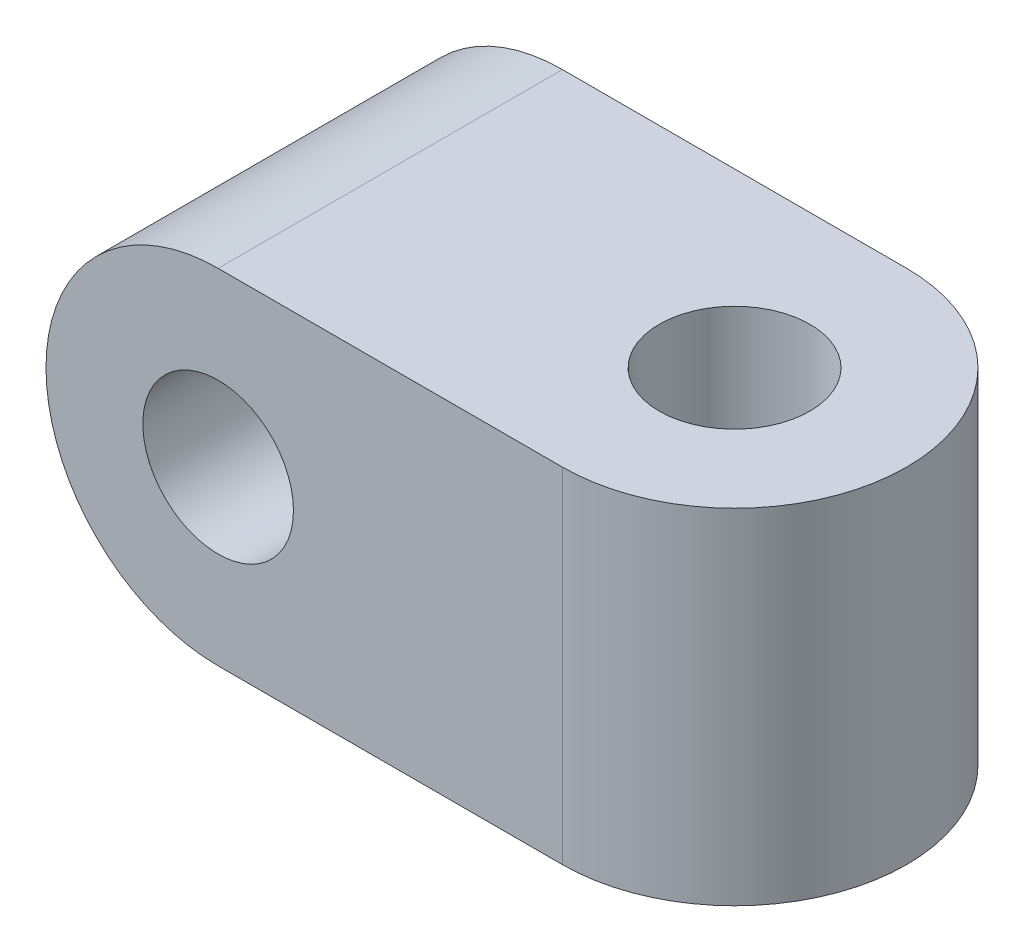
ISO-10303-21;
HEADER;
FILE_DESCRIPTION(('STEP AP214'),'2;1');
FILE_NAME('part.step','',(''),(''),'','','');
FILE_SCHEMA(('AUTOMOTIVE_DESIGN { 1 0 10303 214 1 1 1 1 }'));
ENDSEC;
DATA;
#1=APPLICATION_CONTEXT('core data for automotive mechanical design processes');
#2=APPLICATION_PROTOCOL_DEFINITION('international standard','automotive_design',2000,#1);
#3=PRODUCT_CONTEXT('',#1,'mechanical');
#4=PRODUCT('Part','Part','',(#3));
#5=PRODUCT_RELATED_PRODUCT_CATEGORY('part','',(#4));
#6=PRODUCT_DEFINITION_FORMATION('','',#4);
#7=PRODUCT_DEFINITION_CONTEXT('part definition',#1,'design');
#8=PRODUCT_DEFINITION('design','',#6,#7);
#9=PRODUCT_DEFINITION_SHAPE('','',#8);
#10=(LENGTH_UNIT() NAMED_UNIT(*) SI_UNIT(.MILLI.,.METRE.));
#11=(NAMED_UNIT(*) PLANE_ANGLE_UNIT() SI_UNIT($,.RADIAN.));
#12=(NAMED_UNIT(*) SI_UNIT($,.STERADIAN.) SOLID_ANGLE_UNIT());
#13=UNCERTAINTY_MEASURE_WITH_UNIT(LENGTH_MEASURE(1.E-05),#10,'distance_accuracy_value','');
#14=(GEOMETRIC_REPRESENTATION_CONTEXT(3) GLOBAL_UNCERTAINTY_ASSIGNED_CONTEXT((#13)) GLOBAL_UNIT_ASSIGNED_CONTEXT((#10,
#11,#12)) REPRESENTATION_CONTEXT('',''));
#15=CARTESIAN_POINT('',(0.,0.,0.));
#16=DIRECTION('',(0.,0.,1.));
#17=DIRECTION('',(1.,0.,0.));
#18=AXIS2_PLACEMENT_3D('',#15,#16,#17);
#19=CARTESIAN_POINT('',(0.,12.7,25.4));
#20=DIRECTION('',(0.,1.,0.));
#21=DIRECTION('',(0.,0.,1.));
#22=AXIS2_PLACEMENT_3D('',#19,#20,#21);
#23=PLANE('',#22);
#24=CARTESIAN_POINT('',(12.7,12.7,12.7));
#25=DIRECTION('',(0.,1.,0.));
#26=DIRECTION('',(0.,0.,1.));
#27=AXIS2_PLACEMENT_3D('',#24,#25,#26);
#28=CIRCLE('',#27,5.55625);
#29=CARTESIAN_POINT('',(12.7,12.7,18.25625));
#30=VERTEX_POINT('',#29);
#31=EDGE_CURVE('E190',#30,#30,#28,.T.);
#32=ORIENTED_EDGE('',*,*,#31,.F.);
#33=EDGE_LOOP('',(#32));
#34=FACE_BOUND('',#33,.T.);
#35=DIRECTION('',(1.,0.,0.));
#36=VECTOR('',#35,1.);
#37=CARTESIAN_POINT('',(0.,12.7,25.4));
#38=LINE('',#37,#36);
#39=CARTESIAN_POINT('',(-12.7,12.7,25.4));
#40=VERTEX_POINT('',#39);
#41=CARTESIAN_POINT('',(12.7,12.7,25.4));
#42=VERTEX_POINT('',#41);
#43=EDGE_CURVE('E194',#40,#42,#38,.T.);
#44=ORIENTED_EDGE('',*,*,#43,.T.);
#45=CARTESIAN_POINT('',(12.7,12.7,12.7));
#46=DIRECTION('',(0.,1.,0.));
#47=DIRECTION('',(0.,0.,1.));
#48=AXIS2_PLACEMENT_3D('',#45,#46,#47);
#49=CIRCLE('',#48,12.7);
#50=CARTESIAN_POINT('',(12.7,12.7,0.));
#51=VERTEX_POINT('',#50);
#52=EDGE_CURVE('E127',#51,#42,#49,.F.);
#53=ORIENTED_EDGE('',*,*,#52,.F.);
#54=DIRECTION('',(1.,0.,0.));
#55=VECTOR('',#54,1.);
#56=CARTESIAN_POINT('',(0.,12.7,0.));
#57=LINE('',#56,#55);
#58=CARTESIAN_POINT('',(-12.7,12.7,0.));
#59=VERTEX_POINT('',#58);
#60=EDGE_CURVE('E183',#59,#51,#57,.T.);
#61=ORIENTED_EDGE('',*,*,#60,.F.);
#62=DIRECTION('',(0.,0.,-1.));
#63=VECTOR('',#62,1.);
#64=CARTESIAN_POINT('',(-12.7,12.7,25.4));
#65=LINE('',#64,#63);
#66=EDGE_CURVE('E12',#40,#59,#65,.T.);
#67=ORIENTED_EDGE('',*,*,#66,.F.);
#68=EDGE_LOOP('',(#44,#53,#61,#67));
#69=FACE_BOUND('',#68,.T.);
#70=ADVANCED_FACE('F123',(#34,#69),#23,.T.);
#71=CARTESIAN_POINT('',(0.,-12.7,25.4));
#72=DIRECTION('',(0.,1.,0.));
#73=DIRECTION('',(0.,0.,1.));
#74=AXIS2_PLACEMENT_3D('',#71,#72,#73);
#75=PLANE('',#74);
#76=CARTESIAN_POINT('',(12.7,-12.7,12.7));
#77=DIRECTION('',(0.,1.,0.));
#78=DIRECTION('',(0.,0.,1.));
#79=AXIS2_PLACEMENT_3D('',#76,#77,#78);
#80=CIRCLE('',#79,5.55625);
#81=CARTESIAN_POINT('',(12.7,-12.7,18.25625));
#82=VERTEX_POINT('',#81);
#83=EDGE_CURVE('E200',#82,#82,#80,.T.);
#84=ORIENTED_EDGE('',*,*,#83,.T.);
#85=EDGE_LOOP('',(#84));
#86=FACE_BOUND('',#85,.T.);
#87=CARTESIAN_POINT('',(12.7,-12.7,12.7));
#88=DIRECTION('',(0.,1.,0.));
#89=DIRECTION('',(0.,0.,1.));
#90=AXIS2_PLACEMENT_3D('',#87,#88,#89);
#91=CIRCLE('',#90,12.7);
#92=CARTESIAN_POINT('',(12.7,-12.7,0.));
#93=VERTEX_POINT('',#92);
#94=CARTESIAN_POINT('',(12.7,-12.7,25.4));
#95=VERTEX_POINT('',#94);
#96=EDGE_CURVE('E141',#93,#95,#91,.F.);
#97=ORIENTED_EDGE('',*,*,#96,.T.);
#98=DIRECTION('',(1.,0.,0.));
#99=VECTOR('',#98,1.);
#100=CARTESIAN_POINT('',(0.,-12.7,25.4));
#101=LINE('',#100,#99);
#102=CARTESIAN_POINT('',(-12.7,-12.7,25.4));
#103=VERTEX_POINT('',#102);
#104=EDGE_CURVE('E178',#103,#95,#101,.T.);
#105=ORIENTED_EDGE('',*,*,#104,.F.);
#106=DIRECTION('',(0.,0.,-1.));
#107=VECTOR('',#106,1.);
#108=CARTESIAN_POINT('',(-12.7,-12.7,25.4));
#109=LINE('',#108,#107);
#110=CARTESIAN_POINT('',(-12.7,-12.7,0.));
#111=VERTEX_POINT('',#110);
#112=EDGE_CURVE('E133',#103,#111,#109,.T.);
#113=ORIENTED_EDGE('',*,*,#112,.T.);
#114=DIRECTION('',(1.,0.,0.));
#115=VECTOR('',#114,1.);
#116=CARTESIAN_POINT('',(0.,-12.7,0.));
#117=LINE('',#116,#115);
#118=EDGE_CURVE('E167',#111,#93,#117,.T.);
#119=ORIENTED_EDGE('',*,*,#118,.T.);
#120=EDGE_LOOP('',(#97,#105,#113,#119));
#121=FACE_BOUND('',#120,.T.);
#122=ADVANCED_FACE('F176',(#86,#121),#75,.F.);
#123=CARTESIAN_POINT('',(-12.7,0.,25.4));
#124=DIRECTION('',(0.,0.,-1.));
#125=DIRECTION('',(-1.,0.,0.));
#126=AXIS2_PLACEMENT_3D('',#123,#124,#125);
#127=CYLINDRICAL_SURFACE('',#126,12.7);
#128=CARTESIAN_POINT('',(-12.7,0.,0.));
#129=DIRECTION('',(0.,0.,1.));
#130=DIRECTION('',(1.,0.,0.));
#131=AXIS2_PLACEMENT_3D('',#128,#129,#130);
#132=CIRCLE('',#131,12.7);
#133=EDGE_CURVE('E172',#59,#111,#132,.T.);
#134=ORIENTED_EDGE('',*,*,#133,.T.);
#135=ORIENTED_EDGE('',*,*,#112,.F.);
#136=CARTESIAN_POINT('',(-12.7,0.,25.4));
#137=DIRECTION('',(0.,0.,1.));
#138=DIRECTION('',(1.,0.,0.));
#139=AXIS2_PLACEMENT_3D('',#136,#137,#138);
#140=CIRCLE('',#139,12.7);
#141=EDGE_CURVE('E192',#40,#103,#140,.T.);
#142=ORIENTED_EDGE('',*,*,#141,.F.);
#143=ORIENTED_EDGE('',*,*,#66,.T.);
#144=EDGE_LOOP('',(#134,#135,#142,#143));
#145=FACE_BOUND('',#144,.T.);
#146=ADVANCED_FACE('F182',(#145),#127,.T.);
#147=CARTESIAN_POINT('',(-12.7,0.,25.4));
#148=DIRECTION('',(0.,0.,-1.));
#149=DIRECTION('',(-1.,0.,0.));
#150=AXIS2_PLACEMENT_3D('',#147,#148,#149);
#151=CYLINDRICAL_SURFACE('',#150,5.55625);
#152=CARTESIAN_POINT('',(-12.7,0.,25.4));
#153=DIRECTION('',(0.,0.,1.));
#154=DIRECTION('',(1.,0.,0.));
#155=AXIS2_PLACEMENT_3D('',#152,#153,#154);
#156=CIRCLE('',#155,5.55625);
#157=CARTESIAN_POINT('',(-7.14375,0.,25.4));
#158=VERTEX_POINT('',#157);
#159=EDGE_CURVE('E173',#158,#158,#156,.T.);
#160=ORIENTED_EDGE('',*,*,#159,.T.);
#161=EDGE_LOOP('',(#160));
#162=FACE_BOUND('',#161,.T.);
#163=CARTESIAN_POINT('',(-12.7,0.,0.));
#164=DIRECTION('',(0.,0.,1.));
#165=DIRECTION('',(1.,0.,0.));
#166=AXIS2_PLACEMENT_3D('',#163,#164,#165);
#167=CIRCLE('',#166,5.55625);
#168=CARTESIAN_POINT('',(-7.14375,0.,0.));
#169=VERTEX_POINT('',#168);
#170=EDGE_CURVE('E185',#169,#169,#167,.T.);
#171=ORIENTED_EDGE('',*,*,#170,.F.);
#172=EDGE_LOOP('',(#171));
#173=FACE_BOUND('',#172,.T.);
#174=ADVANCED_FACE('F125',(#162,#173),#151,.F.);
#175=CARTESIAN_POINT('',(0.,0.,25.4));
#176=DIRECTION('',(0.,0.,1.));
#177=DIRECTION('',(1.,0.,0.));
#178=AXIS2_PLACEMENT_3D('',#175,#176,#177);
#179=PLANE('',#178);
#180=DIRECTION('',(0.,1.,0.));
#181=VECTOR('',#180,1.);
#182=CARTESIAN_POINT('',(12.7,-12.7,25.4));
#183=LINE('',#182,#181);
#184=EDGE_CURVE('E205',#95,#42,#183,.T.);
#185=ORIENTED_EDGE('',*,*,#184,.T.);
#186=ORIENTED_EDGE('',*,*,#43,.F.);
#187=ORIENTED_EDGE('',*,*,#141,.T.);
#188=ORIENTED_EDGE('',*,*,#104,.T.);
#189=EDGE_LOOP('',(#185,#186,#187,#188));
#190=FACE_BOUND('',#189,.T.);
#191=ORIENTED_EDGE('',*,*,#159,.F.);
#192=EDGE_LOOP('',(#191));
#193=FACE_BOUND('',#192,.T.);
#194=ADVANCED_FACE('F209',(#190,#193),#179,.T.);
#195=CARTESIAN_POINT('',(0.,0.,0.));
#196=DIRECTION('',(0.,0.,1.));
#197=DIRECTION('',(1.,0.,0.));
#198=AXIS2_PLACEMENT_3D('',#195,#196,#197);
#199=PLANE('',#198);
#200=ORIENTED_EDGE('',*,*,#170,.T.);
#201=EDGE_LOOP('',(#200));
#202=FACE_BOUND('',#201,.T.);
#203=ORIENTED_EDGE('',*,*,#60,.T.);
#204=DIRECTION('',(0.,1.,0.));
#205=VECTOR('',#204,1.);
#206=CARTESIAN_POINT('',(12.7,-12.7,0.));
#207=LINE('',#206,#205);
#208=EDGE_CURVE('E153',#93,#51,#207,.T.);
#209=ORIENTED_EDGE('',*,*,#208,.F.);
#210=ORIENTED_EDGE('',*,*,#118,.F.);
#211=ORIENTED_EDGE('',*,*,#133,.F.);
#212=EDGE_LOOP('',(#203,#209,#210,#211));
#213=FACE_BOUND('',#212,.T.);
#214=ADVANCED_FACE('F170',(#202,#213),#199,.F.);
#215=CARTESIAN_POINT('',(12.7,-12.7,12.7));
#216=DIRECTION('',(0.,1.,0.));
#217=DIRECTION('',(0.,0.,1.));
#218=AXIS2_PLACEMENT_3D('',#215,#216,#217);
#219=CYLINDRICAL_SURFACE('',#218,12.7);
#220=ORIENTED_EDGE('',*,*,#52,.T.);
#221=ORIENTED_EDGE('',*,*,#184,.F.);
#222=ORIENTED_EDGE('',*,*,#96,.F.);
#223=ORIENTED_EDGE('',*,*,#208,.T.);
#224=EDGE_LOOP('',(#220,#221,#222,#223));
#225=FACE_BOUND('',#224,.T.);
#226=ADVANCED_FACE('F211',(#225),#219,.T.);
#227=CARTESIAN_POINT('',(12.7,-12.7,12.7));
#228=DIRECTION('',(0.,1.,0.));
#229=DIRECTION('',(0.,0.,1.));
#230=AXIS2_PLACEMENT_3D('',#227,#228,#229);
#231=CYLINDRICAL_SURFACE('',#230,5.55625);
#232=ORIENTED_EDGE('',*,*,#31,.T.);
#233=EDGE_LOOP('',(#232));
#234=FACE_BOUND('',#233,.T.);
#235=ORIENTED_EDGE('',*,*,#83,.F.);
#236=EDGE_LOOP('',(#235));
#237=FACE_BOUND('',#236,.T.);
#238=ADVANCED_FACE('F213',(#234,#237),#231,.F.);
#239=CLOSED_SHELL('',(#70,#122,#146,#174,#194,#214,#226,#238));
#240=MANIFOLD_SOLID_BREP('B2',#239);
#241=ADVANCED_BREP_SHAPE_REPRESENTATION('',(#18,#240),#14);
#242=SHAPE_DEFINITION_REPRESENTATION(#9,#241);
ENDSEC;
END-ISO-10303-21;
